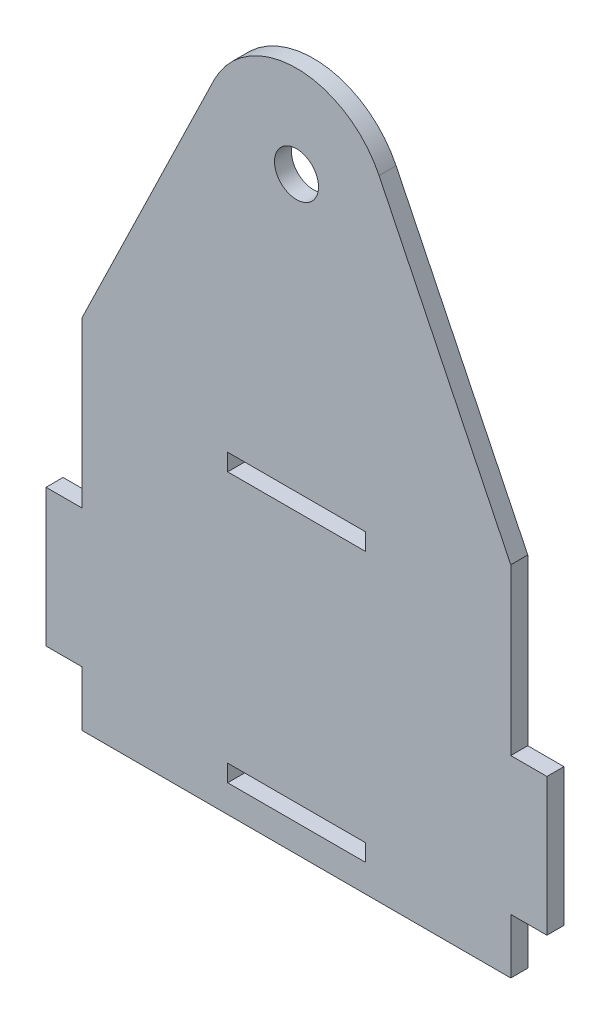
ISO-10303-21;
HEADER;
FILE_DESCRIPTION(('STEP AP214'),'2;1');
FILE_NAME('part.step','',(''),(''),'','','');
FILE_SCHEMA(('AUTOMOTIVE_DESIGN { 1 0 10303 214 1 1 1 1 }'));
ENDSEC;
DATA;
#1=APPLICATION_CONTEXT('core data for automotive mechanical design processes');
#2=APPLICATION_PROTOCOL_DEFINITION('international standard','automotive_design',2000,#1);
#3=PRODUCT_CONTEXT('',#1,'mechanical');
#4=PRODUCT('Part','Part','',(#3));
#5=PRODUCT_RELATED_PRODUCT_CATEGORY('part','',(#4));
#6=PRODUCT_DEFINITION_FORMATION('','',#4);
#7=PRODUCT_DEFINITION_CONTEXT('part definition',#1,'design');
#8=PRODUCT_DEFINITION('design','',#6,#7);
#9=PRODUCT_DEFINITION_SHAPE('','',#8);
#10=(LENGTH_UNIT() NAMED_UNIT(*) SI_UNIT(.MILLI.,.METRE.));
#11=(NAMED_UNIT(*) PLANE_ANGLE_UNIT() SI_UNIT($,.RADIAN.));
#12=(NAMED_UNIT(*) SI_UNIT($,.STERADIAN.) SOLID_ANGLE_UNIT());
#13=UNCERTAINTY_MEASURE_WITH_UNIT(LENGTH_MEASURE(1.E-05),#10,'distance_accuracy_value','');
#14=(GEOMETRIC_REPRESENTATION_CONTEXT(3) GLOBAL_UNCERTAINTY_ASSIGNED_CONTEXT((#13)) GLOBAL_UNIT_ASSIGNED_CONTEXT((#10,
#11,#12)) REPRESENTATION_CONTEXT('',''));
#15=CARTESIAN_POINT('',(0.,0.,0.));
#16=DIRECTION('',(0.,0.,1.));
#17=DIRECTION('',(1.,0.,0.));
#18=AXIS2_PLACEMENT_3D('',#15,#16,#17);
#19=CARTESIAN_POINT('',(0.,-119.885100826657,12.065));
#20=DIRECTION('',(0.,0.,-1.));
#21=DIRECTION('',(-1.,0.,0.));
#22=AXIS2_PLACEMENT_3D('',#19,#20,#21);
#23=PLANE('',#22);
#24=DIRECTION('',(-1.,0.,0.));
#25=VECTOR('',#24,1.);
#26=CARTESIAN_POINT('',(-12.4999999999999,-169.87,12.065));
#27=LINE('',#26,#25);
#28=CARTESIAN_POINT('',(12.5000000000001,-169.87,12.065));
#29=VERTEX_POINT('',#28);
#30=CARTESIAN_POINT('',(-12.4999999999999,-169.87,12.065));
#31=VERTEX_POINT('',#30);
#32=EDGE_CURVE('E203',#29,#31,#27,.T.);
#33=ORIENTED_EDGE('',*,*,#32,.F.);
#34=DIRECTION('',(0.,1.,0.));
#35=VECTOR('',#34,1.);
#36=CARTESIAN_POINT('',(12.5000000000001,-169.87,12.065));
#37=LINE('',#36,#35);
#38=CARTESIAN_POINT('',(12.5000000000001,-172.96,12.065));
#39=VERTEX_POINT('',#38);
#40=EDGE_CURVE('E58',#39,#29,#37,.T.);
#41=ORIENTED_EDGE('',*,*,#40,.F.);
#42=DIRECTION('',(1.,0.,0.));
#43=VECTOR('',#42,1.);
#44=CARTESIAN_POINT('',(-12.4999999999999,-172.96,12.065));
#45=LINE('',#44,#43);
#46=CARTESIAN_POINT('',(-12.4999999999999,-172.96,12.065));
#47=VERTEX_POINT('',#46);
#48=EDGE_CURVE('E209',#47,#39,#45,.T.);
#49=ORIENTED_EDGE('',*,*,#48,.F.);
#50=DIRECTION('',(0.,-1.,0.));
#51=VECTOR('',#50,1.);
#52=CARTESIAN_POINT('',(-12.4999999999999,-169.87,12.065));
#53=LINE('',#52,#51);
#54=EDGE_CURVE('E194',#31,#47,#53,.T.);
#55=ORIENTED_EDGE('',*,*,#54,.F.);
#56=EDGE_LOOP('',(#33,#41,#49,#55));
#57=FACE_BOUND('',#56,.T.);
#58=CARTESIAN_POINT('',(0.,-119.885100826657,12.065));
#59=DIRECTION('',(0.,0.,1.));
#60=DIRECTION('',(1.,0.,0.));
#61=AXIS2_PLACEMENT_3D('',#58,#59,#60);
#62=CIRCLE('',#61,4.);
#63=CARTESIAN_POINT('',(4.00000000000001,-119.885100826657,12.065));
#64=VERTEX_POINT('',#63);
#65=EDGE_CURVE('E250',#64,#64,#62,.T.);
#66=ORIENTED_EDGE('',*,*,#65,.F.);
#67=EDGE_LOOP('',(#66));
#68=FACE_BOUND('',#67,.T.);
#69=DIRECTION('',(1.,0.,0.));
#70=VECTOR('',#69,1.);
#71=CARTESIAN_POINT('',(-45.49,-216.86,12.065));
#72=LINE('',#71,#70);
#73=CARTESIAN_POINT('',(-45.49,-216.86,12.065));
#74=VERTEX_POINT('',#73);
#75=CARTESIAN_POINT('',(-38.92,-216.86,12.065));
#76=VERTEX_POINT('',#75);
#77=EDGE_CURVE('E256',#74,#76,#72,.T.);
#78=ORIENTED_EDGE('',*,*,#77,.T.);
#79=DIRECTION('',(0.,-1.,0.));
#80=VECTOR('',#79,1.);
#81=CARTESIAN_POINT('',(-38.92,-216.86,12.065));
#82=LINE('',#81,#80);
#83=CARTESIAN_POINT('',(-38.92,-226.87,12.065));
#84=VERTEX_POINT('',#83);
#85=EDGE_CURVE('E259',#76,#84,#82,.T.);
#86=ORIENTED_EDGE('',*,*,#85,.T.);
#87=DIRECTION('',(1.,0.,0.));
#88=VECTOR('',#87,1.);
#89=CARTESIAN_POINT('',(-38.92,-226.87,12.065));
#90=LINE('',#89,#88);
#91=CARTESIAN_POINT('',(38.9199999999998,-226.87,12.065));
#92=VERTEX_POINT('',#91);
#93=EDGE_CURVE('E262',#84,#92,#90,.T.);
#94=ORIENTED_EDGE('',*,*,#93,.T.);
#95=DIRECTION('',(0.,1.,0.));
#96=VECTOR('',#95,1.);
#97=CARTESIAN_POINT('',(38.9199999999998,-216.86,12.065));
#98=LINE('',#97,#96);
#99=CARTESIAN_POINT('',(38.9199999999998,-216.86,12.065));
#100=VERTEX_POINT('',#99);
#101=EDGE_CURVE('E264',#92,#100,#98,.T.);
#102=ORIENTED_EDGE('',*,*,#101,.T.);
#103=DIRECTION('',(1.,0.,0.));
#104=VECTOR('',#103,1.);
#105=CARTESIAN_POINT('',(45.49,-216.86,12.065));
#106=LINE('',#105,#104);
#107=CARTESIAN_POINT('',(45.49,-216.86,12.065));
#108=VERTEX_POINT('',#107);
#109=EDGE_CURVE('E266',#100,#108,#106,.T.);
#110=ORIENTED_EDGE('',*,*,#109,.T.);
#111=DIRECTION('',(0.,1.,0.));
#112=VECTOR('',#111,1.);
#113=CARTESIAN_POINT('',(45.49,-216.86,12.065));
#114=LINE('',#113,#112);
#115=CARTESIAN_POINT('',(45.49,-191.88,12.065));
#116=VERTEX_POINT('',#115);
#117=EDGE_CURVE('E268',#108,#116,#114,.T.);
#118=ORIENTED_EDGE('',*,*,#117,.T.);
#119=DIRECTION('',(-1.,0.,0.));
#120=VECTOR('',#119,1.);
#121=CARTESIAN_POINT('',(45.49,-191.88,12.065));
#122=LINE('',#121,#120);
#123=CARTESIAN_POINT('',(38.9199999999998,-191.88,12.065));
#124=VERTEX_POINT('',#123);
#125=EDGE_CURVE('E270',#116,#124,#122,.T.);
#126=ORIENTED_EDGE('',*,*,#125,.T.);
#127=DIRECTION('',(0.,1.,0.));
#128=VECTOR('',#127,1.);
#129=CARTESIAN_POINT('',(38.9199999999998,-191.88,12.065));
#130=LINE('',#129,#128);
#131=CARTESIAN_POINT('',(38.9199999999999,-161.87,12.065));
#132=VERTEX_POINT('',#131);
#133=EDGE_CURVE('E272',#124,#132,#130,.T.);
#134=ORIENTED_EDGE('',*,*,#133,.T.);
#135=DIRECTION('',(-0.43675670894909,0.899579666948937,0.));
#136=VECTOR('',#135,1.);
#137=CARTESIAN_POINT('',(38.9199999999999,-161.87,12.065));
#138=LINE('',#137,#136);
#139=CARTESIAN_POINT('',(15.,-112.602421065279,12.065));
#140=VERTEX_POINT('',#139);
#141=EDGE_CURVE('E274',#132,#140,#138,.T.);
#142=ORIENTED_EDGE('',*,*,#141,.T.);
#143=CARTESIAN_POINT('',(0.,-119.885100826657,12.065));
#144=DIRECTION('',(0.,0.,1.));
#145=DIRECTION('',(-1.,0.,0.));
#146=AXIS2_PLACEMENT_3D('',#143,#144,#145);
#147=CIRCLE('',#146,16.6744542491437);
#148=CARTESIAN_POINT('',(-15.,-112.602421065279,12.065));
#149=VERTEX_POINT('',#148);
#150=EDGE_CURVE('E276',#140,#149,#147,.T.);
#151=ORIENTED_EDGE('',*,*,#150,.T.);
#152=DIRECTION('',(-0.436756708949091,-0.899579666948936,0.));
#153=VECTOR('',#152,1.);
#154=CARTESIAN_POINT('',(-38.9199999999999,-161.87,12.065));
#155=LINE('',#154,#153);
#156=CARTESIAN_POINT('',(-38.9199999999999,-161.87,12.065));
#157=VERTEX_POINT('',#156);
#158=EDGE_CURVE('E278',#149,#157,#155,.T.);
#159=ORIENTED_EDGE('',*,*,#158,.T.);
#160=DIRECTION('',(0.,-1.,0.));
#161=VECTOR('',#160,1.);
#162=CARTESIAN_POINT('',(-38.92,-191.88,12.065));
#163=LINE('',#162,#161);
#164=CARTESIAN_POINT('',(-38.92,-191.88,12.065));
#165=VERTEX_POINT('',#164);
#166=EDGE_CURVE('E280',#157,#165,#163,.T.);
#167=ORIENTED_EDGE('',*,*,#166,.T.);
#168=DIRECTION('',(-1.,0.,0.));
#169=VECTOR('',#168,1.);
#170=CARTESIAN_POINT('',(-45.49,-191.88,12.065));
#171=LINE('',#170,#169);
#172=CARTESIAN_POINT('',(-45.49,-191.88,12.065));
#173=VERTEX_POINT('',#172);
#174=EDGE_CURVE('E282',#165,#173,#171,.T.);
#175=ORIENTED_EDGE('',*,*,#174,.T.);
#176=DIRECTION('',(0.,-1.,0.));
#177=VECTOR('',#176,1.);
#178=CARTESIAN_POINT('',(-45.49,-216.86,12.065));
#179=LINE('',#178,#177);
#180=EDGE_CURVE('E284',#173,#74,#179,.T.);
#181=ORIENTED_EDGE('',*,*,#180,.T.);
#182=EDGE_LOOP('',(#78,#86,#94,#102,#110,#118,#126,#134,#142,#151,#159,#167,#175,#181));
#183=FACE_BOUND('',#182,.T.);
#184=DIRECTION('',(0.,1.,0.));
#185=VECTOR('',#184,1.);
#186=CARTESIAN_POINT('',(12.5,-221.87,12.065));
#187=LINE('',#186,#185);
#188=CARTESIAN_POINT('',(12.5,-221.87,12.065));
#189=VERTEX_POINT('',#188);
#190=CARTESIAN_POINT('',(12.5,-218.78,12.065));
#191=VERTEX_POINT('',#190);
#192=EDGE_CURVE('E219',#189,#191,#187,.T.);
#193=ORIENTED_EDGE('',*,*,#192,.F.);
#194=DIRECTION('',(1.,0.,0.));
#195=VECTOR('',#194,1.);
#196=CARTESIAN_POINT('',(12.5,-221.87,12.065));
#197=LINE('',#196,#195);
#198=CARTESIAN_POINT('',(-12.5,-221.87,12.065));
#199=VERTEX_POINT('',#198);
#200=EDGE_CURVE('E227',#199,#189,#197,.T.);
#201=ORIENTED_EDGE('',*,*,#200,.F.);
#202=DIRECTION('',(0.,-1.,0.));
#203=VECTOR('',#202,1.);
#204=CARTESIAN_POINT('',(-12.5,-221.87,12.065));
#205=LINE('',#204,#203);
#206=CARTESIAN_POINT('',(-12.5,-218.78,12.065));
#207=VERTEX_POINT('',#206);
#208=EDGE_CURVE('E224',#207,#199,#205,.T.);
#209=ORIENTED_EDGE('',*,*,#208,.F.);
#210=DIRECTION('',(-1.,0.,0.));
#211=VECTOR('',#210,1.);
#212=CARTESIAN_POINT('',(-12.5,-218.78,12.065));
#213=LINE('',#212,#211);
#214=EDGE_CURVE('E221',#191,#207,#213,.T.);
#215=ORIENTED_EDGE('',*,*,#214,.F.);
#216=EDGE_LOOP('',(#193,#201,#209,#215));
#217=FACE_BOUND('',#216,.T.);
#218=ADVANCED_FACE('F43',(#57,#68,#183,#217),#23,.F.);
#219=CARTESIAN_POINT('',(0.,-119.885100826657,8.97500000000001));
#220=DIRECTION('',(0.,0.,-1.));
#221=DIRECTION('',(-1.,0.,0.));
#222=AXIS2_PLACEMENT_3D('',#219,#220,#221);
#223=PLANE('',#222);
#224=DIRECTION('',(0.,-1.,0.));
#225=VECTOR('',#224,1.);
#226=CARTESIAN_POINT('',(12.5000000000001,-119.885100826657,8.97500000000001));
#227=LINE('',#226,#225);
#228=CARTESIAN_POINT('',(12.5000000000001,-169.87,8.97500000000001));
#229=VERTEX_POINT('',#228);
#230=CARTESIAN_POINT('',(12.5000000000001,-172.96,8.97500000000001));
#231=VERTEX_POINT('',#230);
#232=EDGE_CURVE('E11',#229,#231,#227,.T.);
#233=ORIENTED_EDGE('',*,*,#232,.F.);
#234=DIRECTION('',(1.,0.,0.));
#235=VECTOR('',#234,1.);
#236=CARTESIAN_POINT('',(0.,-169.87,8.97500000000001));
#237=LINE('',#236,#235);
#238=CARTESIAN_POINT('',(-12.4999999999999,-169.87,8.97500000000001));
#239=VERTEX_POINT('',#238);
#240=EDGE_CURVE('E355',#239,#229,#237,.T.);
#241=ORIENTED_EDGE('',*,*,#240,.F.);
#242=DIRECTION('',(0.,1.,0.));
#243=VECTOR('',#242,1.);
#244=CARTESIAN_POINT('',(-12.4999999999999,-119.885100826657,8.97500000000001));
#245=LINE('',#244,#243);
#246=CARTESIAN_POINT('',(-12.4999999999999,-172.96,8.97500000000001));
#247=VERTEX_POINT('',#246);
#248=EDGE_CURVE('E197',#247,#239,#245,.T.);
#249=ORIENTED_EDGE('',*,*,#248,.F.);
#250=DIRECTION('',(-1.,0.,0.));
#251=VECTOR('',#250,1.);
#252=CARTESIAN_POINT('',(0.,-172.96,8.97500000000001));
#253=LINE('',#252,#251);
#254=EDGE_CURVE('E51',#231,#247,#253,.T.);
#255=ORIENTED_EDGE('',*,*,#254,.F.);
#256=EDGE_LOOP('',(#233,#241,#249,#255));
#257=FACE_BOUND('',#256,.T.);
#258=DIRECTION('',(1.,0.,0.));
#259=VECTOR('',#258,1.);
#260=CARTESIAN_POINT('',(-45.49,-216.86,8.97500000000001));
#261=LINE('',#260,#259);
#262=CARTESIAN_POINT('',(-45.49,-216.86,8.97500000000001));
#263=VERTEX_POINT('',#262);
#264=CARTESIAN_POINT('',(-38.92,-216.86,8.97500000000001));
#265=VERTEX_POINT('',#264);
#266=EDGE_CURVE('E253',#263,#265,#261,.T.);
#267=ORIENTED_EDGE('',*,*,#266,.F.);
#268=DIRECTION('',(0.,-1.,0.));
#269=VECTOR('',#268,1.);
#270=CARTESIAN_POINT('',(-45.49,-216.86,8.97500000000001));
#271=LINE('',#270,#269);
#272=CARTESIAN_POINT('',(-45.49,-191.88,8.97500000000001));
#273=VERTEX_POINT('',#272);
#274=EDGE_CURVE('E260',#273,#263,#271,.T.);
#275=ORIENTED_EDGE('',*,*,#274,.F.);
#276=DIRECTION('',(-1.,0.,0.));
#277=VECTOR('',#276,1.);
#278=CARTESIAN_POINT('',(-45.49,-191.88,8.97500000000001));
#279=LINE('',#278,#277);
#280=CARTESIAN_POINT('',(-38.92,-191.88,8.97500000000001));
#281=VERTEX_POINT('',#280);
#282=EDGE_CURVE('E311',#281,#273,#279,.T.);
#283=ORIENTED_EDGE('',*,*,#282,.F.);
#284=DIRECTION('',(0.,-1.,0.));
#285=VECTOR('',#284,1.);
#286=CARTESIAN_POINT('',(-38.92,-191.88,8.97500000000001));
#287=LINE('',#286,#285);
#288=CARTESIAN_POINT('',(-38.9199999999999,-161.87,8.97500000000001));
#289=VERTEX_POINT('',#288);
#290=EDGE_CURVE('E309',#289,#281,#287,.T.);
#291=ORIENTED_EDGE('',*,*,#290,.F.);
#292=DIRECTION('',(-0.436756708949091,-0.899579666948936,0.));
#293=VECTOR('',#292,1.);
#294=CARTESIAN_POINT('',(-38.9199999999999,-161.87,8.97500000000001));
#295=LINE('',#294,#293);
#296=CARTESIAN_POINT('',(-15.,-112.602421065279,8.97500000000001));
#297=VERTEX_POINT('',#296);
#298=EDGE_CURVE('E307',#297,#289,#295,.T.);
#299=ORIENTED_EDGE('',*,*,#298,.F.);
#300=CARTESIAN_POINT('',(0.,-119.885100826657,8.97500000000001));
#301=DIRECTION('',(0.,0.,1.));
#302=DIRECTION('',(-1.,0.,0.));
#303=AXIS2_PLACEMENT_3D('',#300,#301,#302);
#304=CIRCLE('',#303,16.6744542491437);
#305=CARTESIAN_POINT('',(15.,-112.602421065279,8.97500000000001));
#306=VERTEX_POINT('',#305);
#307=EDGE_CURVE('E305',#306,#297,#304,.T.);
#308=ORIENTED_EDGE('',*,*,#307,.F.);
#309=DIRECTION('',(-0.43675670894909,0.899579666948937,0.));
#310=VECTOR('',#309,1.);
#311=CARTESIAN_POINT('',(38.9199999999999,-161.87,8.97500000000001));
#312=LINE('',#311,#310);
#313=CARTESIAN_POINT('',(38.9199999999999,-161.87,8.97500000000001));
#314=VERTEX_POINT('',#313);
#315=EDGE_CURVE('E303',#314,#306,#312,.T.);
#316=ORIENTED_EDGE('',*,*,#315,.F.);
#317=DIRECTION('',(0.,1.,0.));
#318=VECTOR('',#317,1.);
#319=CARTESIAN_POINT('',(38.9199999999998,-191.88,8.97500000000001));
#320=LINE('',#319,#318);
#321=CARTESIAN_POINT('',(38.9199999999998,-191.88,8.97500000000001));
#322=VERTEX_POINT('',#321);
#323=EDGE_CURVE('E301',#322,#314,#320,.T.);
#324=ORIENTED_EDGE('',*,*,#323,.F.);
#325=DIRECTION('',(-1.,0.,0.));
#326=VECTOR('',#325,1.);
#327=CARTESIAN_POINT('',(45.49,-191.88,8.97500000000001));
#328=LINE('',#327,#326);
#329=CARTESIAN_POINT('',(45.49,-191.88,8.97500000000001));
#330=VERTEX_POINT('',#329);
#331=EDGE_CURVE('E299',#330,#322,#328,.T.);
#332=ORIENTED_EDGE('',*,*,#331,.F.);
#333=DIRECTION('',(0.,1.,0.));
#334=VECTOR('',#333,1.);
#335=CARTESIAN_POINT('',(45.49,-216.86,8.97500000000001));
#336=LINE('',#335,#334);
#337=CARTESIAN_POINT('',(45.49,-216.86,8.97500000000001));
#338=VERTEX_POINT('',#337);
#339=EDGE_CURVE('E297',#338,#330,#336,.T.);
#340=ORIENTED_EDGE('',*,*,#339,.F.);
#341=DIRECTION('',(1.,0.,0.));
#342=VECTOR('',#341,1.);
#343=CARTESIAN_POINT('',(45.49,-216.86,8.97500000000001));
#344=LINE('',#343,#342);
#345=CARTESIAN_POINT('',(38.9199999999998,-216.86,8.97500000000001));
#346=VERTEX_POINT('',#345);
#347=EDGE_CURVE('E295',#346,#338,#344,.T.);
#348=ORIENTED_EDGE('',*,*,#347,.F.);
#349=DIRECTION('',(0.,1.,0.));
#350=VECTOR('',#349,1.);
#351=CARTESIAN_POINT('',(38.9199999999998,-216.86,8.97500000000001));
#352=LINE('',#351,#350);
#353=CARTESIAN_POINT('',(38.9199999999998,-226.87,8.97500000000001));
#354=VERTEX_POINT('',#353);
#355=EDGE_CURVE('E293',#354,#346,#352,.T.);
#356=ORIENTED_EDGE('',*,*,#355,.F.);
#357=DIRECTION('',(1.,0.,0.));
#358=VECTOR('',#357,1.);
#359=CARTESIAN_POINT('',(-38.92,-226.87,8.97500000000001));
#360=LINE('',#359,#358);
#361=CARTESIAN_POINT('',(-38.92,-226.87,8.97500000000001));
#362=VERTEX_POINT('',#361);
#363=EDGE_CURVE('E291',#362,#354,#360,.T.);
#364=ORIENTED_EDGE('',*,*,#363,.F.);
#365=DIRECTION('',(0.,-1.,0.));
#366=VECTOR('',#365,1.);
#367=CARTESIAN_POINT('',(-38.92,-216.86,8.97500000000001));
#368=LINE('',#367,#366);
#369=EDGE_CURVE('E289',#265,#362,#368,.T.);
#370=ORIENTED_EDGE('',*,*,#369,.F.);
#371=EDGE_LOOP('',(#267,#275,#283,#291,#299,#308,#316,#324,#332,#340,#348,#356,#364,#370));
#372=FACE_BOUND('',#371,.T.);
#373=CARTESIAN_POINT('',(0.,-119.885100826657,8.97500000000001));
#374=DIRECTION('',(0.,0.,1.));
#375=DIRECTION('',(1.,0.,0.));
#376=AXIS2_PLACEMENT_3D('',#373,#374,#375);
#377=CIRCLE('',#376,4.);
#378=CARTESIAN_POINT('',(4.00000000000001,-119.885100826657,8.97500000000001));
#379=VERTEX_POINT('',#378);
#380=EDGE_CURVE('E249',#379,#379,#377,.T.);
#381=ORIENTED_EDGE('',*,*,#380,.T.);
#382=EDGE_LOOP('',(#381));
#383=FACE_BOUND('',#382,.T.);
#384=DIRECTION('',(1.,0.,0.));
#385=VECTOR('',#384,1.);
#386=CARTESIAN_POINT('',(12.5,-221.87,8.97500000000001));
#387=LINE('',#386,#385);
#388=CARTESIAN_POINT('',(-12.5,-221.87,8.97500000000001));
#389=VERTEX_POINT('',#388);
#390=CARTESIAN_POINT('',(12.5,-221.87,8.97500000000001));
#391=VERTEX_POINT('',#390);
#392=EDGE_CURVE('E222',#389,#391,#387,.T.);
#393=ORIENTED_EDGE('',*,*,#392,.T.);
#394=DIRECTION('',(0.,1.,0.));
#395=VECTOR('',#394,1.);
#396=CARTESIAN_POINT('',(12.5,-221.87,8.97500000000001));
#397=LINE('',#396,#395);
#398=CARTESIAN_POINT('',(12.5,-218.78,8.97500000000001));
#399=VERTEX_POINT('',#398);
#400=EDGE_CURVE('E216',#391,#399,#397,.T.);
#401=ORIENTED_EDGE('',*,*,#400,.T.);
#402=DIRECTION('',(-1.,0.,0.));
#403=VECTOR('',#402,1.);
#404=CARTESIAN_POINT('',(-12.5,-218.78,8.97500000000001));
#405=LINE('',#404,#403);
#406=CARTESIAN_POINT('',(-12.5,-218.78,8.97500000000001));
#407=VERTEX_POINT('',#406);
#408=EDGE_CURVE('E232',#399,#407,#405,.T.);
#409=ORIENTED_EDGE('',*,*,#408,.T.);
#410=DIRECTION('',(0.,-1.,0.));
#411=VECTOR('',#410,1.);
#412=CARTESIAN_POINT('',(-12.5,-221.87,8.97500000000001));
#413=LINE('',#412,#411);
#414=EDGE_CURVE('E235',#407,#389,#413,.T.);
#415=ORIENTED_EDGE('',*,*,#414,.T.);
#416=EDGE_LOOP('',(#393,#401,#409,#415));
#417=FACE_BOUND('',#416,.T.);
#418=ADVANCED_FACE('F363',(#257,#372,#383,#417),#223,.T.);
#419=CARTESIAN_POINT('',(-45.49,-216.86,12.065));
#420=DIRECTION('',(0.,1.,0.));
#421=DIRECTION('',(0.,0.,1.));
#422=AXIS2_PLACEMENT_3D('',#419,#420,#421);
#423=PLANE('',#422);
#424=ORIENTED_EDGE('',*,*,#266,.T.);
#425=DIRECTION('',(0.,0.,-1.));
#426=VECTOR('',#425,1.);
#427=CARTESIAN_POINT('',(-38.92,-216.86,12.065));
#428=LINE('',#427,#426);
#429=EDGE_CURVE('E352',#76,#265,#428,.T.);
#430=ORIENTED_EDGE('',*,*,#429,.F.);
#431=ORIENTED_EDGE('',*,*,#77,.F.);
#432=DIRECTION('',(0.,0.,-1.));
#433=VECTOR('',#432,1.);
#434=CARTESIAN_POINT('',(-45.49,-216.86,12.065));
#435=LINE('',#434,#433);
#436=EDGE_CURVE('E286',#74,#263,#435,.T.);
#437=ORIENTED_EDGE('',*,*,#436,.T.);
#438=EDGE_LOOP('',(#424,#430,#431,#437));
#439=FACE_BOUND('',#438,.T.);
#440=ADVANCED_FACE('F45',(#439),#423,.F.);
#441=CARTESIAN_POINT('',(-38.92,-216.86,12.065));
#442=DIRECTION('',(1.,0.,0.));
#443=DIRECTION('',(0.,0.,-1.));
#444=AXIS2_PLACEMENT_3D('',#441,#442,#443);
#445=PLANE('',#444);
#446=ORIENTED_EDGE('',*,*,#369,.T.);
#447=DIRECTION('',(0.,0.,-1.));
#448=VECTOR('',#447,1.);
#449=CARTESIAN_POINT('',(-38.92,-226.87,12.065));
#450=LINE('',#449,#448);
#451=EDGE_CURVE('E349',#84,#362,#450,.T.);
#452=ORIENTED_EDGE('',*,*,#451,.F.);
#453=ORIENTED_EDGE('',*,*,#85,.F.);
#454=ORIENTED_EDGE('',*,*,#429,.T.);
#455=EDGE_LOOP('',(#446,#452,#453,#454));
#456=FACE_BOUND('',#455,.T.);
#457=ADVANCED_FACE('F436',(#456),#445,.F.);
#458=CARTESIAN_POINT('',(-38.92,-226.87,12.065));
#459=DIRECTION('',(0.,1.,0.));
#460=DIRECTION('',(-1.,0.,0.));
#461=AXIS2_PLACEMENT_3D('',#458,#459,#460);
#462=PLANE('',#461);
#463=ORIENTED_EDGE('',*,*,#363,.T.);
#464=DIRECTION('',(0.,0.,-1.));
#465=VECTOR('',#464,1.);
#466=CARTESIAN_POINT('',(38.9199999999998,-226.87,12.065));
#467=LINE('',#466,#465);
#468=EDGE_CURVE('E346',#92,#354,#467,.T.);
#469=ORIENTED_EDGE('',*,*,#468,.F.);
#470=ORIENTED_EDGE('',*,*,#93,.F.);
#471=ORIENTED_EDGE('',*,*,#451,.T.);
#472=EDGE_LOOP('',(#463,#469,#470,#471));
#473=FACE_BOUND('',#472,.T.);
#474=ADVANCED_FACE('F433',(#473),#462,.F.);
#475=CARTESIAN_POINT('',(38.9199999999998,-216.86,12.065));
#476=DIRECTION('',(-1.,0.,0.));
#477=DIRECTION('',(0.,-1.,0.));
#478=AXIS2_PLACEMENT_3D('',#475,#476,#477);
#479=PLANE('',#478);
#480=ORIENTED_EDGE('',*,*,#355,.T.);
#481=DIRECTION('',(0.,0.,-1.));
#482=VECTOR('',#481,1.);
#483=CARTESIAN_POINT('',(38.9199999999998,-216.86,12.065));
#484=LINE('',#483,#482);
#485=EDGE_CURVE('E343',#100,#346,#484,.T.);
#486=ORIENTED_EDGE('',*,*,#485,.F.);
#487=ORIENTED_EDGE('',*,*,#101,.F.);
#488=ORIENTED_EDGE('',*,*,#468,.T.);
#489=EDGE_LOOP('',(#480,#486,#487,#488));
#490=FACE_BOUND('',#489,.T.);
#491=ADVANCED_FACE('F429',(#490),#479,.F.);
#492=CARTESIAN_POINT('',(45.49,-216.86,12.065));
#493=DIRECTION('',(0.,1.,0.));
#494=DIRECTION('',(-1.,0.,0.));
#495=AXIS2_PLACEMENT_3D('',#492,#493,#494);
#496=PLANE('',#495);
#497=ORIENTED_EDGE('',*,*,#347,.T.);
#498=DIRECTION('',(0.,0.,-1.));
#499=VECTOR('',#498,1.);
#500=CARTESIAN_POINT('',(45.49,-216.86,12.065));
#501=LINE('',#500,#499);
#502=EDGE_CURVE('E340',#108,#338,#501,.T.);
#503=ORIENTED_EDGE('',*,*,#502,.F.);
#504=ORIENTED_EDGE('',*,*,#109,.F.);
#505=ORIENTED_EDGE('',*,*,#485,.T.);
#506=EDGE_LOOP('',(#497,#503,#504,#505));
#507=FACE_BOUND('',#506,.T.);
#508=ADVANCED_FACE('F425',(#507),#496,.F.);
#509=CARTESIAN_POINT('',(45.49,-216.86,12.065));
#510=DIRECTION('',(-1.,0.,0.));
#511=DIRECTION('',(0.,0.,1.));
#512=AXIS2_PLACEMENT_3D('',#509,#510,#511);
#513=PLANE('',#512);
#514=ORIENTED_EDGE('',*,*,#339,.T.);
#515=DIRECTION('',(0.,0.,-1.));
#516=VECTOR('',#515,1.);
#517=CARTESIAN_POINT('',(45.49,-191.88,12.065));
#518=LINE('',#517,#516);
#519=EDGE_CURVE('E337',#116,#330,#518,.T.);
#520=ORIENTED_EDGE('',*,*,#519,.F.);
#521=ORIENTED_EDGE('',*,*,#117,.F.);
#522=ORIENTED_EDGE('',*,*,#502,.T.);
#523=EDGE_LOOP('',(#514,#520,#521,#522));
#524=FACE_BOUND('',#523,.T.);
#525=ADVANCED_FACE('F421',(#524),#513,.F.);
#526=CARTESIAN_POINT('',(45.49,-191.88,12.065));
#527=DIRECTION('',(0.,-1.,0.));
#528=DIRECTION('',(1.,0.,0.));
#529=AXIS2_PLACEMENT_3D('',#526,#527,#528);
#530=PLANE('',#529);
#531=ORIENTED_EDGE('',*,*,#331,.T.);
#532=DIRECTION('',(0.,0.,-1.));
#533=VECTOR('',#532,1.);
#534=CARTESIAN_POINT('',(38.9199999999998,-191.88,12.065));
#535=LINE('',#534,#533);
#536=EDGE_CURVE('E334',#124,#322,#535,.T.);
#537=ORIENTED_EDGE('',*,*,#536,.F.);
#538=ORIENTED_EDGE('',*,*,#125,.F.);
#539=ORIENTED_EDGE('',*,*,#519,.T.);
#540=EDGE_LOOP('',(#531,#537,#538,#539));
#541=FACE_BOUND('',#540,.T.);
#542=ADVANCED_FACE('F417',(#541),#530,.F.);
#543=CARTESIAN_POINT('',(38.9199999999998,-191.88,12.065));
#544=DIRECTION('',(-1.,0.,0.));
#545=DIRECTION('',(0.,-1.,0.));
#546=AXIS2_PLACEMENT_3D('',#543,#544,#545);
#547=PLANE('',#546);
#548=ORIENTED_EDGE('',*,*,#323,.T.);
#549=DIRECTION('',(0.,0.,-1.));
#550=VECTOR('',#549,1.);
#551=CARTESIAN_POINT('',(38.9199999999999,-161.87,12.065));
#552=LINE('',#551,#550);
#553=EDGE_CURVE('E331',#132,#314,#552,.T.);
#554=ORIENTED_EDGE('',*,*,#553,.F.);
#555=ORIENTED_EDGE('',*,*,#133,.F.);
#556=ORIENTED_EDGE('',*,*,#536,.T.);
#557=EDGE_LOOP('',(#548,#554,#555,#556));
#558=FACE_BOUND('',#557,.T.);
#559=ADVANCED_FACE('F413',(#558),#547,.F.);
#560=CARTESIAN_POINT('',(38.9199999999999,-161.87,12.065));
#561=DIRECTION('',(-0.899579666948937,-0.43675670894909,0.));
#562=DIRECTION('',(0.43675670894909,-0.899579666948937,0.));
#563=AXIS2_PLACEMENT_3D('',#560,#561,#562);
#564=PLANE('',#563);
#565=ORIENTED_EDGE('',*,*,#315,.T.);
#566=DIRECTION('',(0.,0.,-1.));
#567=VECTOR('',#566,1.);
#568=CARTESIAN_POINT('',(15.,-112.602421065279,12.065));
#569=LINE('',#568,#567);
#570=EDGE_CURVE('E328',#140,#306,#569,.T.);
#571=ORIENTED_EDGE('',*,*,#570,.F.);
#572=ORIENTED_EDGE('',*,*,#141,.F.);
#573=ORIENTED_EDGE('',*,*,#553,.T.);
#574=EDGE_LOOP('',(#565,#571,#572,#573));
#575=FACE_BOUND('',#574,.T.);
#576=ADVANCED_FACE('F409',(#575),#564,.F.);
#577=CARTESIAN_POINT('',(0.,-119.885100826657,12.065));
#578=DIRECTION('',(0.,0.,-1.));
#579=DIRECTION('',(-1.,0.,0.));
#580=AXIS2_PLACEMENT_3D('',#577,#578,#579);
#581=CYLINDRICAL_SURFACE('',#580,16.6744542491437);
#582=ORIENTED_EDGE('',*,*,#307,.T.);
#583=DIRECTION('',(0.,0.,-1.));
#584=VECTOR('',#583,1.);
#585=CARTESIAN_POINT('',(-15.,-112.602421065279,12.065));
#586=LINE('',#585,#584);
#587=EDGE_CURVE('E325',#149,#297,#586,.T.);
#588=ORIENTED_EDGE('',*,*,#587,.F.);
#589=ORIENTED_EDGE('',*,*,#150,.F.);
#590=ORIENTED_EDGE('',*,*,#570,.T.);
#591=EDGE_LOOP('',(#582,#588,#589,#590));
#592=FACE_BOUND('',#591,.T.);
#593=ADVANCED_FACE('F405',(#592),#581,.T.);
#594=CARTESIAN_POINT('',(-38.9199999999999,-161.87,12.065));
#595=DIRECTION('',(0.899579666948936,-0.436756708949091,0.));
#596=DIRECTION('',(0.436756708949091,0.899579666948936,0.));
#597=AXIS2_PLACEMENT_3D('',#594,#595,#596);
#598=PLANE('',#597);
#599=ORIENTED_EDGE('',*,*,#298,.T.);
#600=DIRECTION('',(0.,0.,-1.));
#601=VECTOR('',#600,1.);
#602=CARTESIAN_POINT('',(-38.9199999999999,-161.87,12.065));
#603=LINE('',#602,#601);
#604=EDGE_CURVE('E322',#157,#289,#603,.T.);
#605=ORIENTED_EDGE('',*,*,#604,.F.);
#606=ORIENTED_EDGE('',*,*,#158,.F.);
#607=ORIENTED_EDGE('',*,*,#587,.T.);
#608=EDGE_LOOP('',(#599,#605,#606,#607));
#609=FACE_BOUND('',#608,.T.);
#610=ADVANCED_FACE('F401',(#609),#598,.F.);
#611=CARTESIAN_POINT('',(-38.92,-191.88,12.065));
#612=DIRECTION('',(1.,0.,0.));
#613=DIRECTION('',(0.,1.,0.));
#614=AXIS2_PLACEMENT_3D('',#611,#612,#613);
#615=PLANE('',#614);
#616=ORIENTED_EDGE('',*,*,#290,.T.);
#617=DIRECTION('',(0.,0.,-1.));
#618=VECTOR('',#617,1.);
#619=CARTESIAN_POINT('',(-38.92,-191.88,12.065));
#620=LINE('',#619,#618);
#621=EDGE_CURVE('E319',#165,#281,#620,.T.);
#622=ORIENTED_EDGE('',*,*,#621,.F.);
#623=ORIENTED_EDGE('',*,*,#166,.F.);
#624=ORIENTED_EDGE('',*,*,#604,.T.);
#625=EDGE_LOOP('',(#616,#622,#623,#624));
#626=FACE_BOUND('',#625,.T.);
#627=ADVANCED_FACE('F397',(#626),#615,.F.);
#628=CARTESIAN_POINT('',(-45.49,-191.88,12.065));
#629=DIRECTION('',(0.,-1.,0.));
#630=DIRECTION('',(0.,0.,-1.));
#631=AXIS2_PLACEMENT_3D('',#628,#629,#630);
#632=PLANE('',#631);
#633=ORIENTED_EDGE('',*,*,#282,.T.);
#634=DIRECTION('',(0.,0.,-1.));
#635=VECTOR('',#634,1.);
#636=CARTESIAN_POINT('',(-45.49,-191.88,12.065));
#637=LINE('',#636,#635);
#638=EDGE_CURVE('E316',#173,#273,#637,.T.);
#639=ORIENTED_EDGE('',*,*,#638,.F.);
#640=ORIENTED_EDGE('',*,*,#174,.F.);
#641=ORIENTED_EDGE('',*,*,#621,.T.);
#642=EDGE_LOOP('',(#633,#639,#640,#641));
#643=FACE_BOUND('',#642,.T.);
#644=ADVANCED_FACE('F393',(#643),#632,.F.);
#645=CARTESIAN_POINT('',(-45.49,-216.86,12.065));
#646=DIRECTION('',(1.,0.,0.));
#647=DIRECTION('',(0.,0.,-1.));
#648=AXIS2_PLACEMENT_3D('',#645,#646,#647);
#649=PLANE('',#648);
#650=ORIENTED_EDGE('',*,*,#274,.T.);
#651=ORIENTED_EDGE('',*,*,#436,.F.);
#652=ORIENTED_EDGE('',*,*,#180,.F.);
#653=ORIENTED_EDGE('',*,*,#638,.T.);
#654=EDGE_LOOP('',(#650,#651,#652,#653));
#655=FACE_BOUND('',#654,.T.);
#656=ADVANCED_FACE('F390',(#655),#649,.F.);
#657=CARTESIAN_POINT('',(0.,-119.885100826657,12.065));
#658=DIRECTION('',(0.,0.,-1.));
#659=DIRECTION('',(-1.,0.,0.));
#660=AXIS2_PLACEMENT_3D('',#657,#658,#659);
#661=CYLINDRICAL_SURFACE('',#660,4.);
#662=ORIENTED_EDGE('',*,*,#65,.T.);
#663=EDGE_LOOP('',(#662));
#664=FACE_BOUND('',#663,.T.);
#665=ORIENTED_EDGE('',*,*,#380,.F.);
#666=EDGE_LOOP('',(#665));
#667=FACE_BOUND('',#666,.T.);
#668=ADVANCED_FACE('F387',(#664,#667),#661,.F.);
#669=CARTESIAN_POINT('',(12.5,-221.87,12.065));
#670=DIRECTION('',(-1.,0.,0.));
#671=DIRECTION('',(0.,-1.,0.));
#672=AXIS2_PLACEMENT_3D('',#669,#670,#671);
#673=PLANE('',#672);
#674=ORIENTED_EDGE('',*,*,#400,.F.);
#675=DIRECTION('',(0.,0.,-1.));
#676=VECTOR('',#675,1.);
#677=CARTESIAN_POINT('',(12.5,-221.87,12.065));
#678=LINE('',#677,#676);
#679=EDGE_CURVE('E229',#189,#391,#678,.T.);
#680=ORIENTED_EDGE('',*,*,#679,.F.);
#681=ORIENTED_EDGE('',*,*,#192,.T.);
#682=DIRECTION('',(0.,0.,-1.));
#683=VECTOR('',#682,1.);
#684=CARTESIAN_POINT('',(12.5,-218.78,12.065));
#685=LINE('',#684,#683);
#686=EDGE_CURVE('E246',#191,#399,#685,.T.);
#687=ORIENTED_EDGE('',*,*,#686,.T.);
#688=EDGE_LOOP('',(#674,#680,#681,#687));
#689=FACE_BOUND('',#688,.T.);
#690=ADVANCED_FACE('F495',(#689),#673,.T.);
#691=CARTESIAN_POINT('',(-12.5,-218.78,12.065));
#692=DIRECTION('',(0.,-1.,0.));
#693=DIRECTION('',(0.,0.,-1.));
#694=AXIS2_PLACEMENT_3D('',#691,#692,#693);
#695=PLANE('',#694);
#696=ORIENTED_EDGE('',*,*,#408,.F.);
#697=ORIENTED_EDGE('',*,*,#686,.F.);
#698=ORIENTED_EDGE('',*,*,#214,.T.);
#699=DIRECTION('',(0.,0.,-1.));
#700=VECTOR('',#699,1.);
#701=CARTESIAN_POINT('',(-12.5,-218.78,12.065));
#702=LINE('',#701,#700);
#703=EDGE_CURVE('E244',#207,#407,#702,.T.);
#704=ORIENTED_EDGE('',*,*,#703,.T.);
#705=EDGE_LOOP('',(#696,#697,#698,#704));
#706=FACE_BOUND('',#705,.T.);
#707=ADVANCED_FACE('F497',(#706),#695,.T.);
#708=CARTESIAN_POINT('',(-12.5,-221.87,12.065));
#709=DIRECTION('',(1.,0.,0.));
#710=DIRECTION('',(0.,1.,0.));
#711=AXIS2_PLACEMENT_3D('',#708,#709,#710);
#712=PLANE('',#711);
#713=ORIENTED_EDGE('',*,*,#414,.F.);
#714=ORIENTED_EDGE('',*,*,#703,.F.);
#715=ORIENTED_EDGE('',*,*,#208,.T.);
#716=DIRECTION('',(0.,0.,-1.));
#717=VECTOR('',#716,1.);
#718=CARTESIAN_POINT('',(-12.5,-221.87,12.065));
#719=LINE('',#718,#717);
#720=EDGE_CURVE('E242',#199,#389,#719,.T.);
#721=ORIENTED_EDGE('',*,*,#720,.T.);
#722=EDGE_LOOP('',(#713,#714,#715,#721));
#723=FACE_BOUND('',#722,.T.);
#724=ADVANCED_FACE('F375',(#723),#712,.T.);
#725=CARTESIAN_POINT('',(12.5,-221.87,12.065));
#726=DIRECTION('',(0.,1.,0.));
#727=DIRECTION('',(0.,0.,1.));
#728=AXIS2_PLACEMENT_3D('',#725,#726,#727);
#729=PLANE('',#728);
#730=ORIENTED_EDGE('',*,*,#392,.F.);
#731=ORIENTED_EDGE('',*,*,#720,.F.);
#732=ORIENTED_EDGE('',*,*,#200,.T.);
#733=ORIENTED_EDGE('',*,*,#679,.T.);
#734=EDGE_LOOP('',(#730,#731,#732,#733));
#735=FACE_BOUND('',#734,.T.);
#736=ADVANCED_FACE('F367',(#735),#729,.T.);
#737=CARTESIAN_POINT('',(12.5000000000001,-169.87,-32.14));
#738=DIRECTION('',(1.,0.,0.));
#739=DIRECTION('',(0.,0.,-1.));
#740=AXIS2_PLACEMENT_3D('',#737,#738,#739);
#741=PLANE('',#740);
#742=ORIENTED_EDGE('',*,*,#232,.T.);
#743=DIRECTION('',(0.,0.,1.));
#744=VECTOR('',#743,1.);
#745=CARTESIAN_POINT('',(12.5000000000001,-172.96,-32.14));
#746=LINE('',#745,#744);
#747=EDGE_CURVE('E214',#231,#39,#746,.T.);
#748=ORIENTED_EDGE('',*,*,#747,.T.);
#749=ORIENTED_EDGE('',*,*,#40,.T.);
#750=DIRECTION('',(0.,0.,1.));
#751=VECTOR('',#750,1.);
#752=CARTESIAN_POINT('',(12.5000000000001,-169.87,-32.14));
#753=LINE('',#752,#751);
#754=EDGE_CURVE('E200',#229,#29,#753,.T.);
#755=ORIENTED_EDGE('',*,*,#754,.F.);
#756=EDGE_LOOP('',(#742,#748,#749,#755));
#757=FACE_BOUND('',#756,.T.);
#758=ADVANCED_FACE('F365',(#757),#741,.F.);
#759=CARTESIAN_POINT('',(-12.4999999999999,-172.96,-32.14));
#760=DIRECTION('',(0.,-1.,0.));
#761=DIRECTION('',(0.,0.,-1.));
#762=AXIS2_PLACEMENT_3D('',#759,#760,#761);
#763=PLANE('',#762);
#764=ORIENTED_EDGE('',*,*,#254,.T.);
#765=DIRECTION('',(0.,0.,1.));
#766=VECTOR('',#765,1.);
#767=CARTESIAN_POINT('',(-12.4999999999999,-172.96,-32.14));
#768=LINE('',#767,#766);
#769=EDGE_CURVE('E199',#247,#47,#768,.T.);
#770=ORIENTED_EDGE('',*,*,#769,.T.);
#771=ORIENTED_EDGE('',*,*,#48,.T.);
#772=ORIENTED_EDGE('',*,*,#747,.F.);
#773=EDGE_LOOP('',(#764,#770,#771,#772));
#774=FACE_BOUND('',#773,.T.);
#775=ADVANCED_FACE('F360',(#774),#763,.F.);
#776=CARTESIAN_POINT('',(-12.4999999999999,-169.87,-32.14));
#777=DIRECTION('',(-1.,0.,0.));
#778=DIRECTION('',(0.,0.,1.));
#779=AXIS2_PLACEMENT_3D('',#776,#777,#778);
#780=PLANE('',#779);
#781=ORIENTED_EDGE('',*,*,#248,.T.);
#782=DIRECTION('',(0.,0.,1.));
#783=VECTOR('',#782,1.);
#784=CARTESIAN_POINT('',(-12.4999999999999,-169.87,-32.14));
#785=LINE('',#784,#783);
#786=EDGE_CURVE('E66',#239,#31,#785,.T.);
#787=ORIENTED_EDGE('',*,*,#786,.T.);
#788=ORIENTED_EDGE('',*,*,#54,.T.);
#789=ORIENTED_EDGE('',*,*,#769,.F.);
#790=EDGE_LOOP('',(#781,#787,#788,#789));
#791=FACE_BOUND('',#790,.T.);
#792=ADVANCED_FACE('F191',(#791),#780,.F.);
#793=CARTESIAN_POINT('',(-12.4999999999999,-169.87,-32.14));
#794=DIRECTION('',(0.,1.,0.));
#795=DIRECTION('',(0.,0.,1.));
#796=AXIS2_PLACEMENT_3D('',#793,#794,#795);
#797=PLANE('',#796);
#798=ORIENTED_EDGE('',*,*,#240,.T.);
#799=ORIENTED_EDGE('',*,*,#754,.T.);
#800=ORIENTED_EDGE('',*,*,#32,.T.);
#801=ORIENTED_EDGE('',*,*,#786,.F.);
#802=EDGE_LOOP('',(#798,#799,#800,#801));
#803=FACE_BOUND('',#802,.T.);
#804=ADVANCED_FACE('F204',(#803),#797,.F.);
#805=CLOSED_SHELL('',(#218,#418,#440,#457,#474,#491,#508,#525,#542,#559,#576,#593,#610,#627,
#644,#656,#668,#690,#707,#724,#736,#758,#775,#792,#804));
#806=MANIFOLD_SOLID_BREP('B2',#805);
#807=ADVANCED_BREP_SHAPE_REPRESENTATION('',(#18,#806),#14);
#808=SHAPE_DEFINITION_REPRESENTATION(#9,#807);
ENDSEC;
END-ISO-10303-21;
